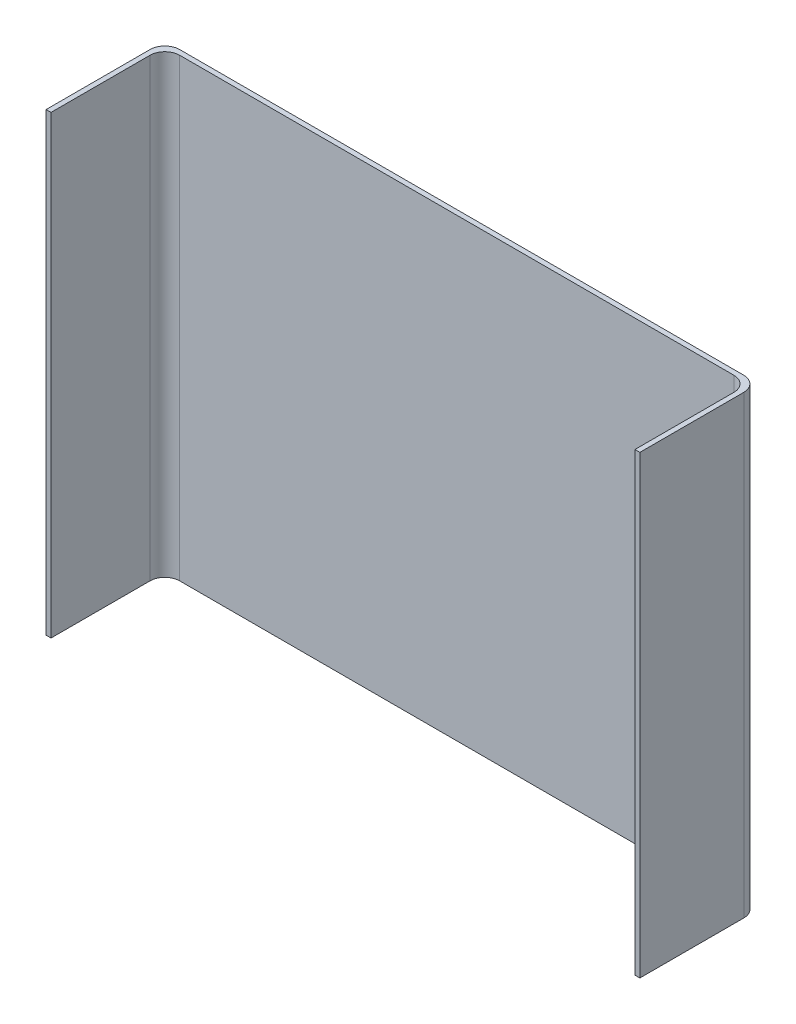
ISO-10303-21;
HEADER;
FILE_DESCRIPTION(('STEP AP214'),'2;1');
FILE_NAME('part.step','',(''),(''),'','','');
FILE_SCHEMA(('AUTOMOTIVE_DESIGN { 1 0 10303 214 1 1 1 1 }'));
ENDSEC;
DATA;
#1=APPLICATION_CONTEXT('core data for automotive mechanical design processes');
#2=APPLICATION_PROTOCOL_DEFINITION('international standard','automotive_design',2000,#1);
#3=PRODUCT_CONTEXT('',#1,'mechanical');
#4=PRODUCT('Part','Part','',(#3));
#5=PRODUCT_RELATED_PRODUCT_CATEGORY('part','',(#4));
#6=PRODUCT_DEFINITION_FORMATION('','',#4);
#7=PRODUCT_DEFINITION_CONTEXT('part definition',#1,'design');
#8=PRODUCT_DEFINITION('design','',#6,#7);
#9=PRODUCT_DEFINITION_SHAPE('','',#8);
#10=(LENGTH_UNIT() NAMED_UNIT(*) SI_UNIT(.MILLI.,.METRE.));
#11=(NAMED_UNIT(*) PLANE_ANGLE_UNIT() SI_UNIT($,.RADIAN.));
#12=(NAMED_UNIT(*) SI_UNIT($,.STERADIAN.) SOLID_ANGLE_UNIT());
#13=UNCERTAINTY_MEASURE_WITH_UNIT(LENGTH_MEASURE(1.E-05),#10,'distance_accuracy_value','');
#14=(GEOMETRIC_REPRESENTATION_CONTEXT(3) GLOBAL_UNCERTAINTY_ASSIGNED_CONTEXT((#13)) GLOBAL_UNIT_ASSIGNED_CONTEXT((#10,
#11,#12)) REPRESENTATION_CONTEXT('',''));
#15=CARTESIAN_POINT('',(0.,0.,0.));
#16=DIRECTION('',(0.,0.,1.));
#17=DIRECTION('',(1.,0.,0.));
#18=AXIS2_PLACEMENT_3D('',#15,#16,#17);
#19=CARTESIAN_POINT('',(59.9999999999999,45.9999999999998,1.));
#20=DIRECTION('',(-1.,0.,0.));
#21=DIRECTION('',(0.,-1.,0.));
#22=AXIS2_PLACEMENT_3D('',#19,#20,#21);
#23=PLANE('',#22);
#24=DIRECTION('',(0.,0.,-1.));
#25=VECTOR('',#24,1.);
#26=CARTESIAN_POINT('',(59.9999999999999,-46.0000000000001,1.));
#27=LINE('',#26,#25);
#28=CARTESIAN_POINT('',(60.0000000000001,-46.0000000000001,24.));
#29=VERTEX_POINT('',#28);
#30=CARTESIAN_POINT('',(59.9999999999999,-46.0000000000001,3.));
#31=VERTEX_POINT('',#30);
#32=EDGE_CURVE('E176',#29,#31,#27,.T.);
#33=ORIENTED_EDGE('',*,*,#32,.T.);
#34=DIRECTION('',(0.,1.,0.));
#35=VECTOR('',#34,1.);
#36=CARTESIAN_POINT('',(59.9999999999999,45.9999999999998,3.));
#37=LINE('',#36,#35);
#38=CARTESIAN_POINT('',(59.9999999999999,45.9999999999998,3.));
#39=VERTEX_POINT('',#38);
#40=EDGE_CURVE('E129',#31,#39,#37,.T.);
#41=ORIENTED_EDGE('',*,*,#40,.T.);
#42=DIRECTION('',(0.,0.,-1.));
#43=VECTOR('',#42,1.);
#44=CARTESIAN_POINT('',(59.9999999999999,45.9999999999998,1.));
#45=LINE('',#44,#43);
#46=CARTESIAN_POINT('',(60.0000000000001,45.9999999999998,24.));
#47=VERTEX_POINT('',#46);
#48=EDGE_CURVE('E123',#47,#39,#45,.T.);
#49=ORIENTED_EDGE('',*,*,#48,.F.);
#50=DIRECTION('',(0.,-1.,0.));
#51=VECTOR('',#50,1.);
#52=CARTESIAN_POINT('',(60.0000000000001,-46.0000000000001,24.));
#53=LINE('',#52,#51);
#54=EDGE_CURVE('E126',#47,#29,#53,.T.);
#55=ORIENTED_EDGE('',*,*,#54,.T.);
#56=EDGE_LOOP('',(#33,#41,#49,#55));
#57=FACE_BOUND('',#56,.T.);
#58=ADVANCED_FACE('F33',(#57),#23,.F.);
#59=CARTESIAN_POINT('',(-60.0000000000001,45.9999999999998,1.));
#60=DIRECTION('',(0.,-1.,0.));
#61=DIRECTION('',(0.,0.,-1.));
#62=AXIS2_PLACEMENT_3D('',#59,#60,#61);
#63=PLANE('',#62);
#64=ORIENTED_EDGE('',*,*,#48,.T.);
#65=CARTESIAN_POINT('',(56.9999999999999,45.9999999999998,3.));
#66=DIRECTION('',(0.,-1.,0.));
#67=DIRECTION('',(0.,0.,-1.));
#68=AXIS2_PLACEMENT_3D('',#65,#66,#67);
#69=CIRCLE('',#68,3.);
#70=CARTESIAN_POINT('',(56.9999999999999,45.9999999999998,0.));
#71=VERTEX_POINT('',#70);
#72=EDGE_CURVE('E206',#39,#71,#69,.F.);
#73=ORIENTED_EDGE('',*,*,#72,.T.);
#74=DIRECTION('',(-1.,0.,0.));
#75=VECTOR('',#74,1.);
#76=CARTESIAN_POINT('',(-60.0000000000001,45.9999999999998,0.));
#77=LINE('',#76,#75);
#78=CARTESIAN_POINT('',(-57.0000000000001,45.9999999999998,0.));
#79=VERTEX_POINT('',#78);
#80=EDGE_CURVE('E170',#71,#79,#77,.T.);
#81=ORIENTED_EDGE('',*,*,#80,.T.);
#82=CARTESIAN_POINT('',(-57.0000000000001,45.9999999999998,3.));
#83=DIRECTION('',(0.,-1.,0.));
#84=DIRECTION('',(0.,0.,-1.));
#85=AXIS2_PLACEMENT_3D('',#82,#83,#84);
#86=CIRCLE('',#85,3.);
#87=CARTESIAN_POINT('',(-60.0000000000001,45.9999999999998,3.));
#88=VERTEX_POINT('',#87);
#89=EDGE_CURVE('E193',#79,#88,#86,.F.);
#90=ORIENTED_EDGE('',*,*,#89,.T.);
#91=DIRECTION('',(0.,0.,-1.));
#92=VECTOR('',#91,1.);
#93=CARTESIAN_POINT('',(-60.0000000000001,45.9999999999998,1.));
#94=LINE('',#93,#92);
#95=CARTESIAN_POINT('',(-60.0000000000001,45.9999999999998,24.));
#96=VERTEX_POINT('',#95);
#97=EDGE_CURVE('E133',#96,#88,#94,.T.);
#98=ORIENTED_EDGE('',*,*,#97,.F.);
#99=DIRECTION('',(-1.,0.,0.));
#100=VECTOR('',#99,1.);
#101=CARTESIAN_POINT('',(-60.0000000000001,45.9999999999998,24.));
#102=LINE('',#101,#100);
#103=CARTESIAN_POINT('',(-59.0000000000001,45.9999999999998,24.));
#104=VERTEX_POINT('',#103);
#105=EDGE_CURVE('E161',#104,#96,#102,.T.);
#106=ORIENTED_EDGE('',*,*,#105,.F.);
#107=DIRECTION('',(0.,0.,-1.));
#108=VECTOR('',#107,1.);
#109=CARTESIAN_POINT('',(-59.0000000000001,45.9999999999998,24.));
#110=LINE('',#109,#108);
#111=CARTESIAN_POINT('',(-59.0000000000001,45.9999999999998,4.));
#112=VERTEX_POINT('',#111);
#113=EDGE_CURVE('E164',#104,#112,#110,.T.);
#114=ORIENTED_EDGE('',*,*,#113,.T.);
#115=CARTESIAN_POINT('',(-56.0000000000001,45.9999999999998,4.));
#116=DIRECTION('',(0.,-1.,0.));
#117=DIRECTION('',(0.,0.,-1.));
#118=AXIS2_PLACEMENT_3D('',#115,#116,#117);
#119=CIRCLE('',#118,3.);
#120=CARTESIAN_POINT('',(-56.0000000000001,45.9999999999998,1.));
#121=VERTEX_POINT('',#120);
#122=EDGE_CURVE('E200',#112,#121,#119,.T.);
#123=ORIENTED_EDGE('',*,*,#122,.T.);
#124=DIRECTION('',(-1.,0.,0.));
#125=VECTOR('',#124,1.);
#126=CARTESIAN_POINT('',(-60.0000000000001,45.9999999999998,1.));
#127=LINE('',#126,#125);
#128=CARTESIAN_POINT('',(56.0000000000001,45.9999999999998,1.));
#129=VERTEX_POINT('',#128);
#130=EDGE_CURVE('E171',#129,#121,#127,.T.);
#131=ORIENTED_EDGE('',*,*,#130,.F.);
#132=CARTESIAN_POINT('',(56.0000000000001,45.9999999999998,4.));
#133=DIRECTION('',(0.,-1.,0.));
#134=DIRECTION('',(0.,0.,-1.));
#135=AXIS2_PLACEMENT_3D('',#132,#133,#134);
#136=CIRCLE('',#135,3.);
#137=CARTESIAN_POINT('',(59.0000000000001,45.9999999999998,4.));
#138=VERTEX_POINT('',#137);
#139=EDGE_CURVE('E41',#129,#138,#136,.T.);
#140=ORIENTED_EDGE('',*,*,#139,.T.);
#141=DIRECTION('',(0.,0.,-1.));
#142=VECTOR('',#141,1.);
#143=CARTESIAN_POINT('',(59.0000000000001,45.9999999999998,24.));
#144=LINE('',#143,#142);
#145=CARTESIAN_POINT('',(59.0000000000001,45.9999999999998,24.));
#146=VERTEX_POINT('',#145);
#147=EDGE_CURVE('E145',#146,#138,#144,.T.);
#148=ORIENTED_EDGE('',*,*,#147,.F.);
#149=DIRECTION('',(1.,0.,0.));
#150=VECTOR('',#149,1.);
#151=CARTESIAN_POINT('',(60.0000000000001,45.9999999999998,24.));
#152=LINE('',#151,#150);
#153=EDGE_CURVE('E139',#146,#47,#152,.T.);
#154=ORIENTED_EDGE('',*,*,#153,.T.);
#155=EDGE_LOOP('',(#64,#73,#81,#90,#98,#106,#114,#123,#131,#140,#148,#154));
#156=FACE_BOUND('',#155,.T.);
#157=ADVANCED_FACE('F144',(#156),#63,.F.);
#158=CARTESIAN_POINT('',(-60.0000000000001,45.9999999999998,1.));
#159=DIRECTION('',(1.,0.,0.));
#160=DIRECTION('',(0.,1.,0.));
#161=AXIS2_PLACEMENT_3D('',#158,#159,#160);
#162=PLANE('',#161);
#163=ORIENTED_EDGE('',*,*,#97,.T.);
#164=DIRECTION('',(0.,-1.,0.));
#165=VECTOR('',#164,1.);
#166=CARTESIAN_POINT('',(-60.0000000000001,45.9999999999998,3.));
#167=LINE('',#166,#165);
#168=CARTESIAN_POINT('',(-60.0000000000001,-46.0000000000001,3.));
#169=VERTEX_POINT('',#168);
#170=EDGE_CURVE('E132',#88,#169,#167,.T.);
#171=ORIENTED_EDGE('',*,*,#170,.T.);
#172=DIRECTION('',(0.,0.,-1.));
#173=VECTOR('',#172,1.);
#174=CARTESIAN_POINT('',(-60.0000000000001,-46.0000000000001,1.));
#175=LINE('',#174,#173);
#176=CARTESIAN_POINT('',(-60.0000000000001,-46.0000000000001,24.));
#177=VERTEX_POINT('',#176);
#178=EDGE_CURVE('E181',#177,#169,#175,.T.);
#179=ORIENTED_EDGE('',*,*,#178,.F.);
#180=DIRECTION('',(0.,-1.,0.));
#181=VECTOR('',#180,1.);
#182=CARTESIAN_POINT('',(-60.0000000000001,-46.0000000000001,24.));
#183=LINE('',#182,#181);
#184=EDGE_CURVE('E154',#96,#177,#183,.T.);
#185=ORIENTED_EDGE('',*,*,#184,.F.);
#186=EDGE_LOOP('',(#163,#171,#179,#185));
#187=FACE_BOUND('',#186,.T.);
#188=ADVANCED_FACE('F237',(#187),#162,.F.);
#189=CARTESIAN_POINT('',(-60.0000000000001,-46.0000000000001,1.));
#190=DIRECTION('',(0.,1.,0.));
#191=DIRECTION('',(0.,0.,1.));
#192=AXIS2_PLACEMENT_3D('',#189,#190,#191);
#193=PLANE('',#192);
#194=DIRECTION('',(1.,0.,0.));
#195=VECTOR('',#194,1.);
#196=CARTESIAN_POINT('',(-60.0000000000001,-46.0000000000001,0.));
#197=LINE('',#196,#195);
#198=CARTESIAN_POINT('',(-57.0000000000001,-46.0000000000001,0.));
#199=VERTEX_POINT('',#198);
#200=CARTESIAN_POINT('',(56.9999999999999,-46.0000000000001,0.));
#201=VERTEX_POINT('',#200);
#202=EDGE_CURVE('E174',#199,#201,#197,.T.);
#203=ORIENTED_EDGE('',*,*,#202,.T.);
#204=CARTESIAN_POINT('',(56.9999999999999,-46.0000000000001,3.));
#205=DIRECTION('',(0.,1.,0.));
#206=DIRECTION('',(0.,0.,1.));
#207=AXIS2_PLACEMENT_3D('',#204,#205,#206);
#208=CIRCLE('',#207,3.);
#209=EDGE_CURVE('E210',#201,#31,#208,.F.);
#210=ORIENTED_EDGE('',*,*,#209,.T.);
#211=ORIENTED_EDGE('',*,*,#32,.F.);
#212=DIRECTION('',(-1.,0.,0.));
#213=VECTOR('',#212,1.);
#214=CARTESIAN_POINT('',(60.0000000000001,-46.0000000000001,24.));
#215=LINE('',#214,#213);
#216=CARTESIAN_POINT('',(59.0000000000001,-46.0000000000001,24.));
#217=VERTEX_POINT('',#216);
#218=EDGE_CURVE('E142',#29,#217,#215,.T.);
#219=ORIENTED_EDGE('',*,*,#218,.T.);
#220=DIRECTION('',(0.,0.,-1.));
#221=VECTOR('',#220,1.);
#222=CARTESIAN_POINT('',(59.0000000000001,-46.0000000000001,24.));
#223=LINE('',#222,#221);
#224=CARTESIAN_POINT('',(59.0000000000001,-46.0000000000001,4.));
#225=VERTEX_POINT('',#224);
#226=EDGE_CURVE('E151',#217,#225,#223,.T.);
#227=ORIENTED_EDGE('',*,*,#226,.T.);
#228=CARTESIAN_POINT('',(56.0000000000001,-46.0000000000001,4.));
#229=DIRECTION('',(0.,1.,0.));
#230=DIRECTION('',(0.,0.,1.));
#231=AXIS2_PLACEMENT_3D('',#228,#229,#230);
#232=CIRCLE('',#231,3.);
#233=CARTESIAN_POINT('',(56.0000000000001,-46.0000000000001,1.));
#234=VERTEX_POINT('',#233);
#235=EDGE_CURVE('E11',#225,#234,#232,.T.);
#236=ORIENTED_EDGE('',*,*,#235,.T.);
#237=DIRECTION('',(1.,0.,0.));
#238=VECTOR('',#237,1.);
#239=CARTESIAN_POINT('',(-60.0000000000001,-46.0000000000001,1.));
#240=LINE('',#239,#238);
#241=CARTESIAN_POINT('',(-56.0000000000001,-46.0000000000001,1.));
#242=VERTEX_POINT('',#241);
#243=EDGE_CURVE('E173',#242,#234,#240,.T.);
#244=ORIENTED_EDGE('',*,*,#243,.F.);
#245=CARTESIAN_POINT('',(-56.0000000000001,-46.0000000000001,4.));
#246=DIRECTION('',(0.,1.,0.));
#247=DIRECTION('',(0.,0.,1.));
#248=AXIS2_PLACEMENT_3D('',#245,#246,#247);
#249=CIRCLE('',#248,3.);
#250=CARTESIAN_POINT('',(-59.0000000000001,-46.0000000000001,4.));
#251=VERTEX_POINT('',#250);
#252=EDGE_CURVE('E203',#242,#251,#249,.T.);
#253=ORIENTED_EDGE('',*,*,#252,.T.);
#254=DIRECTION('',(0.,0.,-1.));
#255=VECTOR('',#254,1.);
#256=CARTESIAN_POINT('',(-59.0000000000001,-46.0000000000001,24.));
#257=LINE('',#256,#255);
#258=CARTESIAN_POINT('',(-59.0000000000001,-46.0000000000001,24.));
#259=VERTEX_POINT('',#258);
#260=EDGE_CURVE('E167',#259,#251,#257,.T.);
#261=ORIENTED_EDGE('',*,*,#260,.F.);
#262=DIRECTION('',(1.,0.,0.));
#263=VECTOR('',#262,1.);
#264=CARTESIAN_POINT('',(-60.0000000000001,-46.0000000000001,24.));
#265=LINE('',#264,#263);
#266=EDGE_CURVE('E157',#177,#259,#265,.T.);
#267=ORIENTED_EDGE('',*,*,#266,.F.);
#268=ORIENTED_EDGE('',*,*,#178,.T.);
#269=CARTESIAN_POINT('',(-57.0000000000001,-46.0000000000001,3.));
#270=DIRECTION('',(0.,1.,0.));
#271=DIRECTION('',(0.,0.,1.));
#272=AXIS2_PLACEMENT_3D('',#269,#270,#271);
#273=CIRCLE('',#272,3.);
#274=EDGE_CURVE('E188',#169,#199,#273,.F.);
#275=ORIENTED_EDGE('',*,*,#274,.T.);
#276=EDGE_LOOP('',(#203,#210,#211,#219,#227,#236,#244,#253,#261,#267,#268,#275));
#277=FACE_BOUND('',#276,.T.);
#278=ADVANCED_FACE('F223',(#277),#193,.F.);
#279=CARTESIAN_POINT('',(0.,0.,1.));
#280=DIRECTION('',(0.,0.,1.));
#281=DIRECTION('',(1.,0.,0.));
#282=AXIS2_PLACEMENT_3D('',#279,#280,#281);
#283=PLANE('',#282);
#284=ORIENTED_EDGE('',*,*,#243,.T.);
#285=DIRECTION('',(0.,1.,0.));
#286=VECTOR('',#285,1.);
#287=CARTESIAN_POINT('',(56.0000000000001,45.9999999999998,1.));
#288=LINE('',#287,#286);
#289=EDGE_CURVE('E212',#234,#129,#288,.T.);
#290=ORIENTED_EDGE('',*,*,#289,.T.);
#291=ORIENTED_EDGE('',*,*,#130,.T.);
#292=DIRECTION('',(0.,1.,0.));
#293=VECTOR('',#292,1.);
#294=CARTESIAN_POINT('',(-56.0000000000001,0.,1.));
#295=LINE('',#294,#293);
#296=EDGE_CURVE('E198',#121,#242,#295,.F.);
#297=ORIENTED_EDGE('',*,*,#296,.T.);
#298=EDGE_LOOP('',(#284,#290,#291,#297));
#299=FACE_BOUND('',#298,.T.);
#300=ADVANCED_FACE('F220',(#299),#283,.T.);
#301=CARTESIAN_POINT('',(0.,0.,0.));
#302=DIRECTION('',(0.,0.,1.));
#303=DIRECTION('',(1.,0.,0.));
#304=AXIS2_PLACEMENT_3D('',#301,#302,#303);
#305=PLANE('',#304);
#306=ORIENTED_EDGE('',*,*,#80,.F.);
#307=DIRECTION('',(0.,1.,0.));
#308=VECTOR('',#307,1.);
#309=CARTESIAN_POINT('',(56.9999999999999,0.,0.));
#310=LINE('',#309,#308);
#311=EDGE_CURVE('E208',#71,#201,#310,.F.);
#312=ORIENTED_EDGE('',*,*,#311,.T.);
#313=ORIENTED_EDGE('',*,*,#202,.F.);
#314=DIRECTION('',(0.,-1.,0.));
#315=VECTOR('',#314,1.);
#316=CARTESIAN_POINT('',(-57.0000000000001,0.,0.));
#317=LINE('',#316,#315);
#318=EDGE_CURVE('E190',#199,#79,#317,.F.);
#319=ORIENTED_EDGE('',*,*,#318,.T.);
#320=EDGE_LOOP('',(#306,#312,#313,#319));
#321=FACE_BOUND('',#320,.T.);
#322=ADVANCED_FACE('F246',(#321),#305,.F.);
#323=CARTESIAN_POINT('',(-59.0000000000001,-46.0000000000001,24.));
#324=DIRECTION('',(-1.,0.,0.));
#325=DIRECTION('',(0.,0.,1.));
#326=AXIS2_PLACEMENT_3D('',#323,#324,#325);
#327=PLANE('',#326);
#328=ORIENTED_EDGE('',*,*,#260,.T.);
#329=DIRECTION('',(0.,1.,0.));
#330=VECTOR('',#329,1.);
#331=CARTESIAN_POINT('',(-59.0000000000001,-46.0000000000001,4.));
#332=LINE('',#331,#330);
#333=EDGE_CURVE('E195',#251,#112,#332,.T.);
#334=ORIENTED_EDGE('',*,*,#333,.T.);
#335=ORIENTED_EDGE('',*,*,#113,.F.);
#336=DIRECTION('',(0.,1.,0.));
#337=VECTOR('',#336,1.);
#338=CARTESIAN_POINT('',(-59.0000000000001,-46.0000000000001,24.));
#339=LINE('',#338,#337);
#340=EDGE_CURVE('E159',#259,#104,#339,.T.);
#341=ORIENTED_EDGE('',*,*,#340,.F.);
#342=EDGE_LOOP('',(#328,#334,#335,#341));
#343=FACE_BOUND('',#342,.T.);
#344=ADVANCED_FACE('F230',(#343),#327,.F.);
#345=CARTESIAN_POINT('',(0.,0.,24.));
#346=DIRECTION('',(0.,0.,-1.));
#347=DIRECTION('',(-1.,0.,0.));
#348=AXIS2_PLACEMENT_3D('',#345,#346,#347);
#349=PLANE('',#348);
#350=ORIENTED_EDGE('',*,*,#184,.T.);
#351=ORIENTED_EDGE('',*,*,#266,.T.);
#352=ORIENTED_EDGE('',*,*,#340,.T.);
#353=ORIENTED_EDGE('',*,*,#105,.T.);
#354=EDGE_LOOP('',(#350,#351,#352,#353));
#355=FACE_BOUND('',#354,.T.);
#356=ADVANCED_FACE('F235',(#355),#349,.F.);
#357=CARTESIAN_POINT('',(-57.0000000000001,45.9999999999998,3.));
#358=DIRECTION('',(0.,-1.,0.));
#359=DIRECTION('',(1.,0.,0.));
#360=AXIS2_PLACEMENT_3D('',#357,#358,#359);
#361=CYLINDRICAL_SURFACE('',#360,3.);
#362=ORIENTED_EDGE('',*,*,#89,.F.);
#363=ORIENTED_EDGE('',*,*,#318,.F.);
#364=ORIENTED_EDGE('',*,*,#274,.F.);
#365=ORIENTED_EDGE('',*,*,#170,.F.);
#366=EDGE_LOOP('',(#362,#363,#364,#365));
#367=FACE_BOUND('',#366,.T.);
#368=ADVANCED_FACE('F249',(#367),#361,.T.);
#369=CARTESIAN_POINT('',(-56.0000000000001,-46.0000000000001,4.));
#370=DIRECTION('',(0.,1.,0.));
#371=DIRECTION('',(0.,0.,1.));
#372=AXIS2_PLACEMENT_3D('',#369,#370,#371);
#373=CYLINDRICAL_SURFACE('',#372,3.);
#374=ORIENTED_EDGE('',*,*,#252,.F.);
#375=ORIENTED_EDGE('',*,*,#296,.F.);
#376=ORIENTED_EDGE('',*,*,#122,.F.);
#377=ORIENTED_EDGE('',*,*,#333,.F.);
#378=EDGE_LOOP('',(#374,#375,#376,#377));
#379=FACE_BOUND('',#378,.T.);
#380=ADVANCED_FACE('F227',(#379),#373,.F.);
#381=CARTESIAN_POINT('',(59.0000000000001,-46.0000000000001,24.));
#382=DIRECTION('',(-1.,0.,0.));
#383=DIRECTION('',(0.,0.,1.));
#384=AXIS2_PLACEMENT_3D('',#381,#382,#383);
#385=PLANE('',#384);
#386=ORIENTED_EDGE('',*,*,#147,.T.);
#387=DIRECTION('',(0.,1.,0.));
#388=VECTOR('',#387,1.);
#389=CARTESIAN_POINT('',(59.0000000000001,-46.0000000000001,4.));
#390=LINE('',#389,#388);
#391=EDGE_CURVE('E54',#138,#225,#390,.F.);
#392=ORIENTED_EDGE('',*,*,#391,.T.);
#393=ORIENTED_EDGE('',*,*,#226,.F.);
#394=DIRECTION('',(0.,1.,0.));
#395=VECTOR('',#394,1.);
#396=CARTESIAN_POINT('',(59.0000000000001,-46.0000000000001,24.));
#397=LINE('',#396,#395);
#398=EDGE_CURVE('E146',#217,#146,#397,.T.);
#399=ORIENTED_EDGE('',*,*,#398,.T.);
#400=EDGE_LOOP('',(#386,#392,#393,#399));
#401=FACE_BOUND('',#400,.T.);
#402=ADVANCED_FACE('F218',(#401),#385,.T.);
#403=CARTESIAN_POINT('',(0.,0.,24.));
#404=DIRECTION('',(0.,0.,-1.));
#405=DIRECTION('',(1.,0.,0.));
#406=AXIS2_PLACEMENT_3D('',#403,#404,#405);
#407=PLANE('',#406);
#408=ORIENTED_EDGE('',*,*,#54,.F.);
#409=ORIENTED_EDGE('',*,*,#153,.F.);
#410=ORIENTED_EDGE('',*,*,#398,.F.);
#411=ORIENTED_EDGE('',*,*,#218,.F.);
#412=EDGE_LOOP('',(#408,#409,#410,#411));
#413=FACE_BOUND('',#412,.T.);
#414=ADVANCED_FACE('F137',(#413),#407,.F.);
#415=CARTESIAN_POINT('',(56.9999999999999,45.9999999999998,3.));
#416=DIRECTION('',(0.,1.,0.));
#417=DIRECTION('',(-1.,0.,0.));
#418=AXIS2_PLACEMENT_3D('',#415,#416,#417);
#419=CYLINDRICAL_SURFACE('',#418,3.);
#420=ORIENTED_EDGE('',*,*,#209,.F.);
#421=ORIENTED_EDGE('',*,*,#311,.F.);
#422=ORIENTED_EDGE('',*,*,#72,.F.);
#423=ORIENTED_EDGE('',*,*,#40,.F.);
#424=EDGE_LOOP('',(#420,#421,#422,#423));
#425=FACE_BOUND('',#424,.T.);
#426=ADVANCED_FACE('F251',(#425),#419,.T.);
#427=CARTESIAN_POINT('',(56.0000000000001,0.,4.));
#428=DIRECTION('',(0.,-1.,0.));
#429=DIRECTION('',(0.,0.,-1.));
#430=AXIS2_PLACEMENT_3D('',#427,#428,#429);
#431=CYLINDRICAL_SURFACE('',#430,3.);
#432=ORIENTED_EDGE('',*,*,#235,.F.);
#433=ORIENTED_EDGE('',*,*,#391,.F.);
#434=ORIENTED_EDGE('',*,*,#139,.F.);
#435=ORIENTED_EDGE('',*,*,#289,.F.);
#436=EDGE_LOOP('',(#432,#433,#434,#435));
#437=FACE_BOUND('',#436,.T.);
#438=ADVANCED_FACE('F35',(#437),#431,.F.);
#439=CLOSED_SHELL('',(#58,#157,#188,#278,#300,#322,#344,#356,#368,#380,#402,#414,#426,#438));
#440=MANIFOLD_SOLID_BREP('B2',#439);
#441=ADVANCED_BREP_SHAPE_REPRESENTATION('',(#18,#440),#14);
#442=SHAPE_DEFINITION_REPRESENTATION(#9,#441);
ENDSEC;
END-ISO-10303-21;
